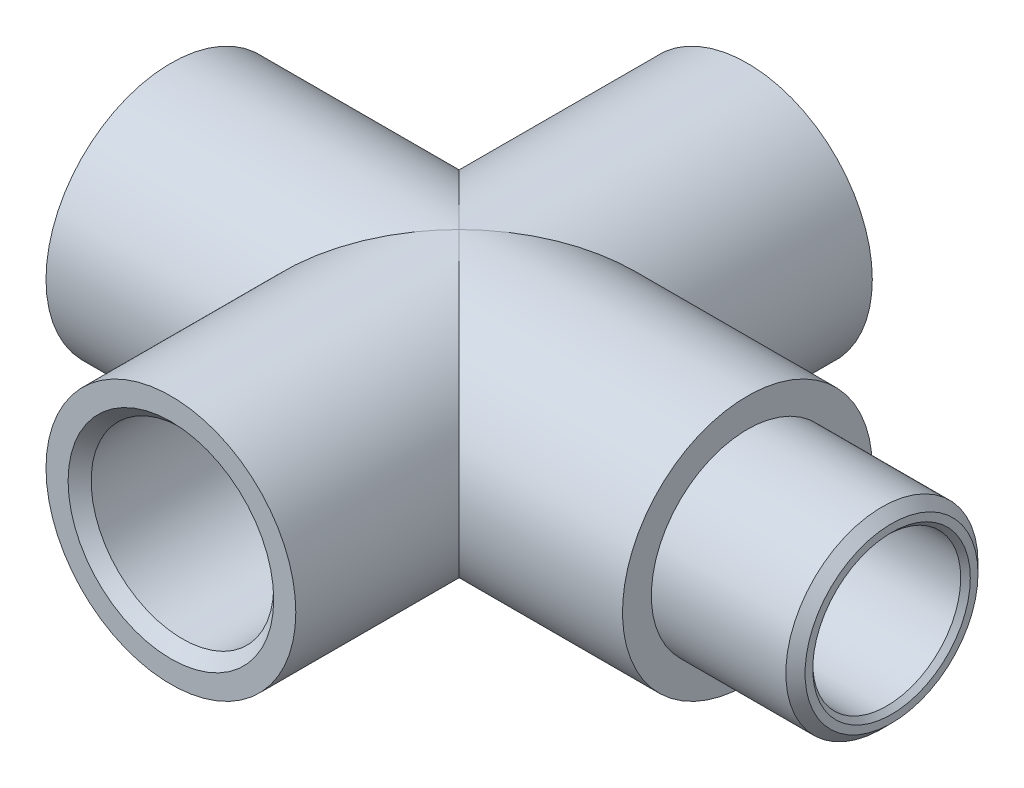
ISO-10303-21;
HEADER;
FILE_DESCRIPTION(('STEP AP214'),'2;1');
FILE_NAME('part.step','',(''),(''),'','','');
FILE_SCHEMA(('AUTOMOTIVE_DESIGN { 1 0 10303 214 1 1 1 1 }'));
ENDSEC;
DATA;
#1=APPLICATION_CONTEXT('core data for automotive mechanical design processes');
#2=APPLICATION_PROTOCOL_DEFINITION('international standard','automotive_design',2000,#1);
#3=PRODUCT_CONTEXT('',#1,'mechanical');
#4=PRODUCT('Part','Part','',(#3));
#5=PRODUCT_RELATED_PRODUCT_CATEGORY('part','',(#4));
#6=PRODUCT_DEFINITION_FORMATION('','',#4);
#7=PRODUCT_DEFINITION_CONTEXT('part definition',#1,'design');
#8=PRODUCT_DEFINITION('design','',#6,#7);
#9=PRODUCT_DEFINITION_SHAPE('','',#8);
#10=(LENGTH_UNIT() NAMED_UNIT(*) SI_UNIT(.MILLI.,.METRE.));
#11=(NAMED_UNIT(*) PLANE_ANGLE_UNIT() SI_UNIT($,.RADIAN.));
#12=(NAMED_UNIT(*) SI_UNIT($,.STERADIAN.) SOLID_ANGLE_UNIT());
#13=UNCERTAINTY_MEASURE_WITH_UNIT(LENGTH_MEASURE(1.E-05),#10,'distance_accuracy_value','');
#14=(GEOMETRIC_REPRESENTATION_CONTEXT(3) GLOBAL_UNCERTAINTY_ASSIGNED_CONTEXT((#13)) GLOBAL_UNIT_ASSIGNED_CONTEXT((#10,
#11,#12)) REPRESENTATION_CONTEXT('',''));
#15=CARTESIAN_POINT('',(0.,0.,0.));
#16=DIRECTION('',(0.,0.,1.));
#17=DIRECTION('',(1.,0.,0.));
#18=AXIS2_PLACEMENT_3D('',#15,#16,#17);
#19=CARTESIAN_POINT('',(45.,0.,0.));
#20=DIRECTION('',(-1.,0.,0.));
#21=DIRECTION('',(0.,0.,1.));
#22=AXIS2_PLACEMENT_3D('',#19,#20,#21);
#23=CYLINDRICAL_SURFACE('',#22,13.);
#24=CARTESIAN_POINT('',(0.,0.,0.));
#25=DIRECTION('',(0.707106781186547,0.,-0.707106781186548));
#26=DIRECTION('',(-0.707106781186547,0.,-0.707106781186548));
#27=AXIS2_PLACEMENT_3D('',#24,#25,#26);
#28=ELLIPSE('',#27,18.3847763108502,13.);
#29=CARTESIAN_POINT('',(0.,13.,0.));
#30=VERTEX_POINT('',#29);
#31=CARTESIAN_POINT('',(0.,-13.,0.));
#32=VERTEX_POINT('',#31);
#33=EDGE_CURVE('E50',#30,#32,#28,.F.);
#34=ORIENTED_EDGE('',*,*,#33,.T.);
#35=CARTESIAN_POINT('',(0.,0.,0.));
#36=DIRECTION('',(-0.707106781186547,0.,-0.707106781186548));
#37=DIRECTION('',(0.707106781186547,0.,-0.707106781186548));
#38=AXIS2_PLACEMENT_3D('',#35,#36,#37);
#39=ELLIPSE('',#38,18.3847763108502,13.);
#40=EDGE_CURVE('E147',#32,#30,#39,.T.);
#41=ORIENTED_EDGE('',*,*,#40,.T.);
#42=EDGE_LOOP('',(#34,#41));
#43=FACE_BOUND('',#42,.T.);
#44=CARTESIAN_POINT('',(-30.,0.,0.));
#45=DIRECTION('',(-1.,0.,0.));
#46=DIRECTION('',(0.,0.,1.));
#47=AXIS2_PLACEMENT_3D('',#44,#45,#46);
#48=CIRCLE('',#47,13.);
#49=CARTESIAN_POINT('',(-30.,0.,13.));
#50=VERTEX_POINT('',#49);
#51=EDGE_CURVE('E59',#50,#50,#48,.T.);
#52=ORIENTED_EDGE('',*,*,#51,.F.);
#53=EDGE_LOOP('',(#52));
#54=FACE_BOUND('',#53,.T.);
#55=ADVANCED_FACE('F29',(#43,#54),#23,.T.);
#56=CARTESIAN_POINT('',(45.001,0.,0.));
#57=DIRECTION('',(-1.,0.,0.));
#58=DIRECTION('',(0.,0.,1.));
#59=AXIS2_PLACEMENT_3D('',#56,#57,#58);
#60=CYLINDRICAL_SURFACE('',#59,9.5);
#61=CARTESIAN_POINT('',(-28.8,0.,0.));
#62=DIRECTION('',(-1.,0.,0.));
#63=DIRECTION('',(0.,0.,1.));
#64=AXIS2_PLACEMENT_3D('',#61,#62,#63);
#65=CIRCLE('',#64,9.5);
#66=CARTESIAN_POINT('',(-28.8,0.,9.5));
#67=VERTEX_POINT('',#66);
#68=EDGE_CURVE('E166',#67,#67,#65,.T.);
#69=ORIENTED_EDGE('',*,*,#68,.T.);
#70=EDGE_LOOP('',(#69));
#71=FACE_BOUND('',#70,.T.);
#72=CARTESIAN_POINT('',(0.,0.,0.));
#73=DIRECTION('',(-0.707106781186547,0.,0.707106781186547));
#74=DIRECTION('',(-0.707106781186547,0.,-0.707106781186547));
#75=AXIS2_PLACEMENT_3D('',#72,#73,#74);
#76=ELLIPSE('',#75,13.4350288425444,9.5);
#77=CARTESIAN_POINT('',(0.,-9.5,0.));
#78=VERTEX_POINT('',#77);
#79=CARTESIAN_POINT('',(0.,9.5,0.));
#80=VERTEX_POINT('',#79);
#81=EDGE_CURVE('E43',#78,#80,#76,.F.);
#82=ORIENTED_EDGE('',*,*,#81,.T.);
#83=CARTESIAN_POINT('',(0.,0.,0.));
#84=DIRECTION('',(-0.707106781186547,0.,-0.707106781186547));
#85=DIRECTION('',(-0.707106781186547,0.,0.707106781186547));
#86=AXIS2_PLACEMENT_3D('',#83,#84,#85);
#87=ELLIPSE('',#86,13.4350288425444,9.5);
#88=EDGE_CURVE('E56',#80,#78,#87,.F.);
#89=ORIENTED_EDGE('',*,*,#88,.T.);
#90=EDGE_LOOP('',(#82,#89));
#91=FACE_BOUND('',#90,.T.);
#92=ADVANCED_FACE('F57',(#71,#91),#60,.F.);
#93=CARTESIAN_POINT('',(0.,0.,0.));
#94=DIRECTION('',(0.707106781186547,0.,-0.707106781186548));
#95=DIRECTION('',(-0.707106781186547,0.,-0.707106781186548));
#96=AXIS2_PLACEMENT_3D('',#93,#94,#95);
#97=ELLIPSE('',#96,18.3847763108502,13.);
#98=EDGE_CURVE('E132',#30,#32,#97,.T.);
#99=ORIENTED_EDGE('',*,*,#98,.T.);
#100=CARTESIAN_POINT('',(0.,0.,0.));
#101=DIRECTION('',(-0.707106781186547,0.,-0.707106781186548));
#102=DIRECTION('',(0.707106781186547,0.,-0.707106781186548));
#103=AXIS2_PLACEMENT_3D('',#100,#101,#102);
#104=ELLIPSE('',#103,18.3847763108502,13.);
#105=EDGE_CURVE('E149',#32,#30,#104,.F.);
#106=ORIENTED_EDGE('',*,*,#105,.T.);
#107=EDGE_LOOP('',(#99,#106));
#108=FACE_BOUND('',#107,.T.);
#109=CARTESIAN_POINT('',(30.,0.,0.));
#110=DIRECTION('',(1.,0.,0.));
#111=DIRECTION('',(0.,0.,-1.));
#112=AXIS2_PLACEMENT_3D('',#109,#110,#111);
#113=CIRCLE('',#112,13.);
#114=CARTESIAN_POINT('',(30.,0.,-13.));
#115=VERTEX_POINT('',#114);
#116=EDGE_CURVE('E135',#115,#115,#113,.T.);
#117=ORIENTED_EDGE('',*,*,#116,.F.);
#118=EDGE_LOOP('',(#117));
#119=FACE_BOUND('',#118,.T.);
#120=ADVANCED_FACE('F82',(#108,#119),#23,.T.);
#121=CARTESIAN_POINT('',(0.,0.,30.));
#122=DIRECTION('',(0.,0.,-1.));
#123=DIRECTION('',(-1.,0.,0.));
#124=AXIS2_PLACEMENT_3D('',#121,#122,#123);
#125=CYLINDRICAL_SURFACE('',#124,13.);
#126=CARTESIAN_POINT('',(0.,0.,30.));
#127=DIRECTION('',(0.,0.,1.));
#128=DIRECTION('',(1.,0.,0.));
#129=AXIS2_PLACEMENT_3D('',#126,#127,#128);
#130=CIRCLE('',#129,13.);
#131=CARTESIAN_POINT('',(13.,0.,30.));
#132=VERTEX_POINT('',#131);
#133=EDGE_CURVE('E139',#132,#132,#130,.T.);
#134=ORIENTED_EDGE('',*,*,#133,.F.);
#135=EDGE_LOOP('',(#134));
#136=FACE_BOUND('',#135,.T.);
#137=ORIENTED_EDGE('',*,*,#40,.F.);
#138=ORIENTED_EDGE('',*,*,#98,.F.);
#139=EDGE_LOOP('',(#137,#138));
#140=FACE_BOUND('',#139,.T.);
#141=ADVANCED_FACE('F121',(#136,#140),#125,.T.);
#142=CARTESIAN_POINT('',(0.,0.,30.));
#143=DIRECTION('',(0.,0.,1.));
#144=DIRECTION('',(1.,0.,0.));
#145=AXIS2_PLACEMENT_3D('',#142,#143,#144);
#146=PLANE('',#145);
#147=CARTESIAN_POINT('',(0.,0.,30.));
#148=DIRECTION('',(0.,0.,1.));
#149=DIRECTION('',(1.,0.,0.));
#150=AXIS2_PLACEMENT_3D('',#147,#148,#149);
#151=CIRCLE('',#150,10.7000000000001);
#152=CARTESIAN_POINT('',(10.7000000000001,0.,30.));
#153=VERTEX_POINT('',#152);
#154=EDGE_CURVE('E160',#153,#153,#151,.F.);
#155=ORIENTED_EDGE('',*,*,#154,.T.);
#156=EDGE_LOOP('',(#155));
#157=FACE_BOUND('',#156,.T.);
#158=ORIENTED_EDGE('',*,*,#133,.T.);
#159=EDGE_LOOP('',(#158));
#160=FACE_BOUND('',#159,.T.);
#161=ADVANCED_FACE('F127',(#157,#160),#146,.T.);
#162=CARTESIAN_POINT('',(0.,0.,-30.));
#163=DIRECTION('',(0.,0.,1.));
#164=DIRECTION('',(1.,0.,0.));
#165=AXIS2_PLACEMENT_3D('',#162,#163,#164);
#166=PLANE('',#165);
#167=CARTESIAN_POINT('',(0.,0.,-30.));
#168=DIRECTION('',(0.,0.,1.));
#169=DIRECTION('',(1.,0.,0.));
#170=AXIS2_PLACEMENT_3D('',#167,#168,#169);
#171=CIRCLE('',#170,10.6999999999999);
#172=CARTESIAN_POINT('',(10.6999999999999,0.,-30.));
#173=VERTEX_POINT('',#172);
#174=EDGE_CURVE('E151',#173,#173,#171,.T.);
#175=ORIENTED_EDGE('',*,*,#174,.T.);
#176=EDGE_LOOP('',(#175));
#177=FACE_BOUND('',#176,.T.);
#178=CARTESIAN_POINT('',(0.,0.,-30.));
#179=DIRECTION('',(0.,0.,1.));
#180=DIRECTION('',(1.,0.,0.));
#181=AXIS2_PLACEMENT_3D('',#178,#179,#180);
#182=CIRCLE('',#181,13.);
#183=CARTESIAN_POINT('',(13.,0.,-30.));
#184=VERTEX_POINT('',#183);
#185=EDGE_CURVE('E137',#184,#184,#182,.T.);
#186=ORIENTED_EDGE('',*,*,#185,.F.);
#187=EDGE_LOOP('',(#186));
#188=FACE_BOUND('',#187,.T.);
#189=ADVANCED_FACE('F197',(#177,#188),#166,.F.);
#190=ORIENTED_EDGE('',*,*,#185,.T.);
#191=EDGE_LOOP('',(#190));
#192=FACE_BOUND('',#191,.T.);
#193=ORIENTED_EDGE('',*,*,#105,.F.);
#194=ORIENTED_EDGE('',*,*,#33,.F.);
#195=EDGE_LOOP('',(#193,#194));
#196=FACE_BOUND('',#195,.T.);
#197=ADVANCED_FACE('F31',(#192,#196),#125,.T.);
#198=CARTESIAN_POINT('',(30.,0.,0.));
#199=DIRECTION('',(1.,0.,0.));
#200=DIRECTION('',(0.,0.,-1.));
#201=AXIS2_PLACEMENT_3D('',#198,#199,#200);
#202=PLANE('',#201);
#203=CARTESIAN_POINT('',(30.,0.,0.));
#204=DIRECTION('',(1.,0.,0.));
#205=DIRECTION('',(0.,0.,-1.));
#206=AXIS2_PLACEMENT_3D('',#203,#204,#205);
#207=CIRCLE('',#206,10.);
#208=CARTESIAN_POINT('',(30.,0.,-10.));
#209=VERTEX_POINT('',#208);
#210=EDGE_CURVE('E66',#209,#209,#207,.T.);
#211=ORIENTED_EDGE('',*,*,#210,.F.);
#212=EDGE_LOOP('',(#211));
#213=FACE_BOUND('',#212,.T.);
#214=ORIENTED_EDGE('',*,*,#116,.T.);
#215=EDGE_LOOP('',(#214));
#216=FACE_BOUND('',#215,.T.);
#217=ADVANCED_FACE('F192',(#213,#216),#202,.T.);
#218=CARTESIAN_POINT('',(30.,0.,0.));
#219=DIRECTION('',(1.,0.,0.));
#220=DIRECTION('',(0.,0.,-1.));
#221=AXIS2_PLACEMENT_3D('',#218,#219,#220);
#222=CYLINDRICAL_SURFACE('',#221,10.);
#223=CARTESIAN_POINT('',(44.,0.,0.));
#224=DIRECTION('',(1.,0.,0.));
#225=DIRECTION('',(0.,0.,-1.));
#226=AXIS2_PLACEMENT_3D('',#223,#224,#225);
#227=CIRCLE('',#226,10.);
#228=CARTESIAN_POINT('',(44.,0.,-10.));
#229=VERTEX_POINT('',#228);
#230=EDGE_CURVE('E172',#229,#229,#227,.F.);
#231=ORIENTED_EDGE('',*,*,#230,.T.);
#232=EDGE_LOOP('',(#231));
#233=FACE_BOUND('',#232,.T.);
#234=ORIENTED_EDGE('',*,*,#210,.T.);
#235=EDGE_LOOP('',(#234));
#236=FACE_BOUND('',#235,.T.);
#237=ADVANCED_FACE('F186',(#233,#236),#222,.T.);
#238=CARTESIAN_POINT('',(45.,0.,0.));
#239=DIRECTION('',(1.,0.,0.));
#240=DIRECTION('',(0.,0.,-1.));
#241=AXIS2_PLACEMENT_3D('',#238,#239,#240);
#242=PLANE('',#241);
#243=CARTESIAN_POINT('',(45.,0.,0.));
#244=DIRECTION('',(1.,0.,0.));
#245=DIRECTION('',(0.,0.,-1.));
#246=AXIS2_PLACEMENT_3D('',#243,#244,#245);
#247=CIRCLE('',#246,8.20000000000005);
#248=CARTESIAN_POINT('',(45.,0.,-8.20000000000005));
#249=VERTEX_POINT('',#248);
#250=EDGE_CURVE('E11',#249,#249,#247,.F.);
#251=ORIENTED_EDGE('',*,*,#250,.T.);
#252=EDGE_LOOP('',(#251));
#253=FACE_BOUND('',#252,.T.);
#254=CARTESIAN_POINT('',(45.,0.,0.));
#255=DIRECTION('',(1.,0.,0.));
#256=DIRECTION('',(0.,0.,-1.));
#257=AXIS2_PLACEMENT_3D('',#254,#255,#256);
#258=CIRCLE('',#257,9.00000000000001);
#259=CARTESIAN_POINT('',(45.,0.,-9.00000000000001));
#260=VERTEX_POINT('',#259);
#261=EDGE_CURVE('E169',#260,#260,#258,.T.);
#262=ORIENTED_EDGE('',*,*,#261,.T.);
#263=EDGE_LOOP('',(#262));
#264=FACE_BOUND('',#263,.T.);
#265=ADVANCED_FACE('F180',(#253,#264),#242,.T.);
#266=CARTESIAN_POINT('',(0.,0.,-60.));
#267=DIRECTION('',(0.,0.,1.));
#268=DIRECTION('',(1.,0.,0.));
#269=AXIS2_PLACEMENT_3D('',#266,#267,#268);
#270=CYLINDRICAL_SURFACE('',#269,9.5);
#271=CARTESIAN_POINT('',(0.,0.,-28.8000000000001));
#272=DIRECTION('',(0.,0.,1.));
#273=DIRECTION('',(1.,0.,0.));
#274=AXIS2_PLACEMENT_3D('',#271,#272,#273);
#275=CIRCLE('',#274,9.5);
#276=CARTESIAN_POINT('',(9.5,0.,-28.8000000000001));
#277=VERTEX_POINT('',#276);
#278=EDGE_CURVE('E157',#277,#277,#275,.F.);
#279=ORIENTED_EDGE('',*,*,#278,.T.);
#280=EDGE_LOOP('',(#279));
#281=FACE_BOUND('',#280,.T.);
#282=CARTESIAN_POINT('',(0.,0.,28.7999999999999));
#283=DIRECTION('',(0.,0.,1.));
#284=DIRECTION('',(1.,0.,0.));
#285=AXIS2_PLACEMENT_3D('',#282,#283,#284);
#286=CIRCLE('',#285,9.5);
#287=CARTESIAN_POINT('',(9.5,0.,28.7999999999999));
#288=VERTEX_POINT('',#287);
#289=EDGE_CURVE('E154',#288,#288,#286,.T.);
#290=ORIENTED_EDGE('',*,*,#289,.T.);
#291=EDGE_LOOP('',(#290));
#292=FACE_BOUND('',#291,.T.);
#293=ORIENTED_EDGE('',*,*,#88,.F.);
#294=ORIENTED_EDGE('',*,*,#81,.F.);
#295=EDGE_LOOP('',(#293,#294));
#296=FACE_BOUND('',#295,.T.);
#297=CARTESIAN_POINT('',(9.50000000000001,0.,-7.7));
#298=CARTESIAN_POINT('',(9.50000060199562,-0.184294837328589,-7.70000061363437));
#299=CARTESIAN_POINT('',(9.494626786743,-0.368581821131114,-7.69337360535048));
#300=CARTESIAN_POINT('',(9.47325779956869,-0.735661957974504,-7.66698595033189));
#301=CARTESIAN_POINT('',(9.45725856634274,-0.918454512751833,-7.6472202816653));
#302=CARTESIAN_POINT('',(9.41498391258546,-1.2811963398829,-7.5948772177766));
#303=CARTESIAN_POINT('',(9.38869666747434,-1.46114209175324,-7.56228508014538));
#304=CARTESIAN_POINT('',(9.32641942953679,-1.81672756486546,-7.48482662025045));
#305=CARTESIAN_POINT('',(9.29042523014909,-1.99236538315643,-7.43995497647153));
#306=CARTESIAN_POINT('',(9.20976066191922,-2.33696751166175,-7.33897861461643));
#307=CARTESIAN_POINT('',(9.16515044790267,-2.50596884239948,-7.28295170054767));
#308=CARTESIAN_POINT('',(9.0679190089043,-2.83773569600927,-7.16020660422362));
#309=CARTESIAN_POINT('',(9.01529429137498,-3.00049846135519,-7.09348376024329));
#310=CARTESIAN_POINT('',(8.90296441466743,-3.31899558127656,-6.9501623136121));
#311=CARTESIAN_POINT('',(8.84326156455398,-3.47473220519266,-6.87356693092451));
#312=CARTESIAN_POINT('',(8.71767687908596,-3.77878011533007,-6.71122452940511));
#313=CARTESIAN_POINT('',(8.65179376471883,-3.92708985476543,-6.62547561573109));
#314=CARTESIAN_POINT('',(8.4904732572727,-4.26716933365774,-6.41361000791218));
#315=CARTESIAN_POINT('',(8.39283860478066,-4.45570685611452,-6.28395924320942));
#316=CARTESIAN_POINT('',(8.19018692523885,-4.81808763632922,-6.01062231671128));
#317=CARTESIAN_POINT('',(8.08516749732521,-4.99192607443509,-5.86693158441342));
#318=CARTESIAN_POINT('',(7.86973559082798,-5.32510197048703,-5.56630648323618));
#319=CARTESIAN_POINT('',(7.75930974439182,-5.48440037315586,-5.40933850823564));
#320=CARTESIAN_POINT('',(7.53565416441958,-5.78786998519767,-5.08332182967543));
#321=CARTESIAN_POINT('',(7.42242476292585,-5.93204297547431,-4.91427455231192));
#322=CARTESIAN_POINT('',(7.19375832851689,-6.20744630690823,-4.5616324541405));
#323=CARTESIAN_POINT('',(7.07831573473458,-6.33842340005267,-4.37784339756106));
#324=CARTESIAN_POINT('',(6.85003646974171,-6.58446346351502,-3.99825325492573));
#325=CARTESIAN_POINT('',(6.73720065472872,-6.69952126534029,-3.80244829733066));
#326=CARTESIAN_POINT('',(6.51810110843805,-6.91286189916482,-3.39915048705089));
#327=CARTESIAN_POINT('',(6.41182071851336,-7.01118847159316,-3.19169005693006));
#328=CARTESIAN_POINT('',(6.21021745534324,-7.19036610648815,-2.76447041219176));
#329=CARTESIAN_POINT('',(6.11488518815135,-7.27123220401641,-2.54472198562962));
#330=CARTESIAN_POINT('',(5.92948374761042,-7.4234403985535,-2.06261187873916));
#331=CARTESIAN_POINT('',(5.84175587946682,-7.49213102324588,-1.79844685014092));
#332=CARTESIAN_POINT('',(5.73416091550723,-7.57439394885963,-1.39199842729054));
#333=CARTESIAN_POINT('',(5.70230894673812,-7.59834349731201,-1.25491231921265));
#334=CARTESIAN_POINT('',(5.64781782479695,-7.63893389367137,-0.977883626959548));
#335=CARTESIAN_POINT('',(5.62517397991777,-7.65557846394154,-0.83794253571841));
#336=CARTESIAN_POINT('',(5.58996074178087,-7.68132974362423,-0.554626560856323));
#337=CARTESIAN_POINT('',(5.57749690721442,-7.69035750363813,-0.411231187907534));
#338=CARTESIAN_POINT('',(5.56369112296523,-7.70035168462259,-0.123624571188604));
#339=CARTESIAN_POINT('',(5.56234850042442,-7.70131859329262,0.0205866226942667));
#340=CARTESIAN_POINT('',(5.57086087522769,-7.69516311508476,0.308580525317448));
#341=CARTESIAN_POINT('',(5.58072213337322,-7.68803620532939,0.452362949423261));
#342=CARTESIAN_POINT('',(5.61112216096261,-7.66587604236562,0.738174195384513));
#343=CARTESIAN_POINT('',(5.63166239485853,-7.6508417047757,0.880202773992409));
#344=CARTESIAN_POINT('',(5.68587790921006,-7.61065558097644,1.18064015152002));
#345=CARTESIAN_POINT('',(5.72096079018183,-7.58440498132662,1.33864631573403));
#346=CARTESIAN_POINT('',(5.80175525862541,-7.52277923240657,1.65016367741425));
#347=CARTESIAN_POINT('',(5.84747468906847,-7.48739734797319,1.80367146344906));
#348=CARTESIAN_POINT('',(5.94765445765314,-7.40806935844173,2.10594127585473));
#349=CARTESIAN_POINT('',(6.00213605178837,-7.3641023698851,2.25469067928437));
#350=CARTESIAN_POINT('',(6.11786692869187,-7.26824288854571,2.54681660898496));
#351=CARTESIAN_POINT('',(6.17911461602819,-7.2163522630431,2.69019439124137));
#352=CARTESIAN_POINT('',(6.34014457086626,-7.07595623094524,3.04532728880174));
#353=CARTESIAN_POINT('',(6.44331870284603,-6.98250090635934,3.2535979613594));
#354=CARTESIAN_POINT('',(6.65680162084462,-6.77928849771215,3.65821456767469));
#355=CARTESIAN_POINT('',(6.76711395829882,-6.66952326330973,3.85455446990848));
#356=CARTESIAN_POINT('',(6.99127768621696,-6.43416550785932,4.23576941930396));
#357=CARTESIAN_POINT('',(7.1051332842018,-6.30855358351901,4.42062998946262));
#358=CARTESIAN_POINT('',(7.33320148392262,-6.04193179674476,4.77858252447695));
#359=CARTESIAN_POINT('',(7.44741401960812,-5.90092463622134,4.95167654577269));
#360=CARTESIAN_POINT('',(7.67740149448922,-5.59864035288438,5.29137283305578));
#361=CARTESIAN_POINT('',(7.79310097995119,-5.43684310964351,5.45756450214391));
#362=CARTESIAN_POINT('',(8.01951028313257,-5.09697505128744,5.77625385805733));
#363=CARTESIAN_POINT('',(8.13021934958703,-4.91890179809371,5.92874948646726));
#364=CARTESIAN_POINT('',(8.3438410446587,-4.54710762171198,6.21845866803888));
#365=CARTESIAN_POINT('',(8.44677027157175,-4.35342194473164,6.35570506763527));
#366=CARTESIAN_POINT('',(8.64252091138817,-3.95056064818939,6.61363852178494));
#367=CARTESIAN_POINT('',(8.73534662928147,-3.7413916902101,6.7343326348232));
#368=CARTESIAN_POINT('',(8.88415494358704,-3.36898002035042,6.92609302854562));
#369=CARTESIAN_POINT('',(8.94318635826871,-3.20922834507842,7.00160487549002));
#370=CARTESIAN_POINT('',(9.05370940967248,-2.88271245627872,7.1422367978665));
#371=CARTESIAN_POINT('',(9.10520290824283,-2.71594998754447,7.20735943976689));
#372=CARTESIAN_POINT('',(9.19971056771638,-2.37621484182019,7.32638946974355));
#373=CARTESIAN_POINT('',(9.24272871579446,-2.20324513048104,7.38030213214783));
#374=CARTESIAN_POINT('',(9.31946624407271,-1.85198831184051,7.47618068607392));
#375=CARTESIAN_POINT('',(9.35318540751884,-1.67370108069809,7.51814629911755));
#376=CARTESIAN_POINT('',(9.4107676999669,-1.31194204960503,7.58966413929109));
#377=CARTESIAN_POINT('',(9.43457086787055,-1.12844567629803,7.61914086504735));
#378=CARTESIAN_POINT('',(9.47147485696979,-0.758730799367607,7.66479072828746));
#379=CARTESIAN_POINT('',(9.48457568804063,-0.572512298256118,7.68096387804679));
#380=CARTESIAN_POINT('',(9.49975465413367,-0.198980715256382,7.69969925906128));
#381=CARTESIAN_POINT('',(9.50183510622421,-0.011667871748919,7.70226435145224));
#382=CARTESIAN_POINT('',(9.49492681775657,0.362433326599813,7.69374044188107));
#383=CARTESIAN_POINT('',(9.48593879653898,0.549221714734755,7.68265232724148));
#384=CARTESIAN_POINT('',(9.45845206905349,0.90348194279088,7.64868638360257));
#385=CARTESIAN_POINT('',(9.44090877357427,1.07114403255274,7.62699245055871));
#386=CARTESIAN_POINT('',(9.39722892961385,1.40364239821743,7.57285728963266));
#387=CARTESIAN_POINT('',(9.37108952173921,1.56847771460576,7.54041248557512));
#388=CARTESIAN_POINT('',(9.31071514512386,1.89420540598275,7.46524730038459));
#389=CARTESIAN_POINT('',(9.27648284502691,2.05509906147966,7.42253030644259));
#390=CARTESIAN_POINT('',(9.20050098179044,2.37221035540694,7.32734872139414));
#391=CARTESIAN_POINT('',(9.15874858744702,2.52842620679131,7.27488045884187));
#392=CARTESIAN_POINT('',(9.06622613490185,2.8428264146149,7.1580577971094));
#393=CARTESIAN_POINT('',(9.01511901419872,3.00074426427957,7.09325318669798));
#394=CARTESIAN_POINT('',(8.90620586876285,3.3100492255716,6.95430480582851));
#395=CARTESIAN_POINT('',(8.8483972122549,3.46143373923313,6.88015736532619));
#396=CARTESIAN_POINT('',(8.66613879359168,3.90514029212346,6.64469072842269));
#397=CARTESIAN_POINT('',(8.53283518527151,4.18708605276842,6.47032051316196));
#398=CARTESIAN_POINT('',(8.28863532291001,4.64721652076225,6.1440793301269));
#399=CARTESIAN_POINT('',(8.18165361047685,4.83261792527714,5.99920129755334));
#400=CARTESIAN_POINT('',(7.96143842465426,5.18739103407368,5.69521704863639));
#401=CARTESIAN_POINT('',(7.84820490657325,5.35676262374131,5.53611073057584));
#402=CARTESIAN_POINT('',(7.61780730707473,5.67965284962913,5.20435173231928));
#403=CARTESIAN_POINT('',(7.50063487506292,5.83313456997565,5.03166907783328));
#404=CARTESIAN_POINT('',(7.26534273581407,6.12370051383776,4.67369514937104));
#405=CARTESIAN_POINT('',(7.14722326208122,6.26078865429786,4.48840690393522));
#406=CARTESIAN_POINT('',(6.93085888314652,6.49884672220416,4.13440765064028));
#407=CARTESIAN_POINT('',(6.83231448759198,6.60214194169395,3.96743896545707));
#408=CARTESIAN_POINT('',(6.63898446021813,6.79651861329242,3.62439186367326));
#409=CARTESIAN_POINT('',(6.54419932580834,6.88759845288575,3.44831224860958));
#410=CARTESIAN_POINT('',(6.36136240780996,7.05680818389331,3.0872461739263));
#411=CARTESIAN_POINT('',(6.2732948588981,7.13496893204753,2.90228234006234));
#412=CARTESIAN_POINT('',(6.10709400424157,7.2777328141055,2.52303132221984));
#413=CARTESIAN_POINT('',(6.02895499375723,7.34234374747221,2.32874958133553));
#414=CARTESIAN_POINT('',(5.86632498841086,7.47329039362943,1.87367756790926));
#415=CARTESIAN_POINT('',(5.78639714290445,7.53484517520923,1.60974378670471));
#416=CARTESIAN_POINT('',(5.69156926962994,7.60641850156115,1.20466507324402));
#417=CARTESIAN_POINT('',(5.66414593311875,7.62681065817269,1.06819083016532));
#418=CARTESIAN_POINT('',(5.61873402975673,7.66032837321451,0.792825092815481));
#419=CARTESIAN_POINT('',(5.60074081879279,7.67345750868763,0.653934823266377));
#420=CARTESIAN_POINT('',(5.57493291356991,7.69222883206169,0.373530331058795));
#421=CARTESIAN_POINT('',(5.56720394050529,7.69780797386593,0.232003897741596));
#422=CARTESIAN_POINT('',(5.56260504918981,7.70113198615733,-0.051316023751375));
#423=CARTESIAN_POINT('',(5.56573473836164,7.69887713986961,-0.193109502087331));
#424=CARTESIAN_POINT('',(5.58269347177577,7.68658835323148,-0.47580871015171));
#425=CARTESIAN_POINT('',(5.59653023162788,7.67654880314393,-0.616713725796757));
#426=CARTESIAN_POINT('',(5.63422020752641,7.64892817490951,-0.896480053102158));
#427=CARTESIAN_POINT('',(5.658078897452,7.63134297529032,-1.03534020491224));
#428=CARTESIAN_POINT('',(5.72031954315889,7.58483580858621,-1.33713744772598));
#429=CARTESIAN_POINT('',(5.76063550400881,7.5543639486384,-1.49943551329211));
#430=CARTESIAN_POINT('',(5.85192971834556,7.48386496825469,-1.81894829448751));
#431=CARTESIAN_POINT('',(5.90291638590248,7.44383030381019,-1.97615888490846));
#432=CARTESIAN_POINT('',(6.01347735336912,7.3548034253363,-2.28534788213801));
#433=CARTESIAN_POINT('',(6.07307242617907,7.30578946437586,-2.43731249818031));
#434=CARTESIAN_POINT('',(6.19874455888461,7.19946847526783,-2.73545195682357));
#435=CARTESIAN_POINT('',(6.2648199159369,7.14216362387099,-2.88162830632737));
#436=CARTESIAN_POINT('',(6.43670058558546,6.98842528479531,-3.24150867743236));
#437=CARTESIAN_POINT('',(6.54557294286116,6.88694749370795,-3.45160471799929));
#438=CARTESIAN_POINT('',(6.76944242262004,6.66703221414109,-3.85932094930584));
#439=CARTESIAN_POINT('',(6.88444241628748,6.54858673054988,-4.05693519506169));
#440=CARTESIAN_POINT('',(7.11694946376056,6.29512867711167,-4.44006277850239));
#441=CARTESIAN_POINT('',(7.23445919942864,6.16009756868408,-4.62556221367826));
#442=CARTESIAN_POINT('',(7.46875182896219,5.87383717676454,-4.98403791053235));
#443=CARTESIAN_POINT('',(7.58553484531295,5.72261070572116,-5.1570163378637));
#444=CARTESIAN_POINT('',(7.81849258265193,5.40015702770602,-5.49399624402912));
#445=CARTESIAN_POINT('',(7.93458334916725,5.22853267080144,-5.65767685000565));
#446=CARTESIAN_POINT('',(8.16047463409989,4.86845244949779,-5.97034497130274));
#447=CARTESIAN_POINT('',(8.27027410187515,4.67999378715224,-6.11933003545902));
#448=CARTESIAN_POINT('',(8.48062551556872,4.28702144843522,-6.40075934552939));
#449=CARTESIAN_POINT('',(8.58119783512655,4.0825450866915,-6.53324027629221));
#450=CARTESIAN_POINT('',(8.77062123003475,3.65789257531555,-6.78012236707602));
#451=CARTESIAN_POINT('',(8.85947861091994,3.43772497058349,-6.89453325986684));
#452=CARTESIAN_POINT('',(8.99763572601267,3.05295799974159,-7.07102940998996));
#453=CARTESIAN_POINT('',(9.0506950673476,2.89210204253091,-7.13838372781406));
#454=CARTESIAN_POINT('',(9.14902240191604,2.56411313375472,-7.2626480393755));
#455=CARTESIAN_POINT('',(9.19429240115762,2.3969818118466,-7.31956072242321));
#456=CARTESIAN_POINT('',(9.27614483371056,2.05756064082482,-7.42211664655673));
#457=CARTESIAN_POINT('',(9.31274302032148,1.88528079603075,-7.46778032876913));
#458=CARTESIAN_POINT('',(9.37661970149916,1.53637392898918,-7.54728806760158));
#459=CARTESIAN_POINT('',(9.40390137211446,1.3597484102617,-7.58113615230757));
#460=CARTESIAN_POINT('',(9.45059839127935,0.98718574100941,-7.63898749916614));
#461=CARTESIAN_POINT('',(9.46907873672074,0.790947156254707,-7.66182300811734));
#462=CARTESIAN_POINT('',(9.49378078518808,0.396469684723349,-7.69233086786498));
#463=CARTESIAN_POINT('',(9.49999935248447,0.198230299302138,-7.69999933996565));
#464=CARTESIAN_POINT('',(9.50000000000001,0.,-7.7));
#465=B_SPLINE_CURVE_WITH_KNOTS('',3,(#297,#298,#299,#300,#301,#302,#303,#304,#305,#306,#307,
#308,#309,#310,#311,#312,#313,#314,#315,#316,#317,#318,#319,#320,#321,#322,#323,#324,#325,#326,
#327,#328,#329,#330,#331,#332,#333,#334,#335,#336,#337,#338,#339,#340,#341,#342,#343,#344,#345,
#346,#347,#348,#349,#350,#351,#352,#353,#354,#355,#356,#357,#358,#359,#360,#361,#362,#363,#364,
#365,#366,#367,#368,#369,#370,#371,#372,#373,#374,#375,#376,#377,#378,#379,#380,#381,#382,#383,
#384,#385,#386,#387,#388,#389,#390,#391,#392,#393,#394,#395,#396,#397,#398,#399,#400,#401,#402,
#403,#404,#405,#406,#407,#408,#409,#410,#411,#412,#413,#414,#415,#416,#417,#418,#419,#420,#421,
#422,#423,#424,#425,#426,#427,#428,#429,#430,#431,#432,#433,#434,#435,#436,#437,#438,#439,#440,
#441,#442,#443,#444,#445,#446,#447,#448,#449,#450,#451,#452,#453,#454,#455,#456,#457,#458,#459,
#460,#461,#462,#463,#464),.UNSPECIFIED.,.T.,.F.,(4,2,2,2,2,2,2,2,2,2,2,2,2,2,2,2,2,2,2,2,2,2,2,
2,2,2,2,2,2,2,2,2,2,2,2,2,2,2,2,2,2,2,2,2,2,2,2,2,2,2,2,2,2,2,2,2,2,2,2,2,2,2,2,2,2,2,2,2,2,2,2,
2,2,2,2,2,2,2,2,2,2,2,2,4),(0.,0.552675636742636,1.1055626418058,1.65908698548329,
2.21285158846806,2.76288126041661,3.31315131291708,3.86324234490785,4.41344747106293,
5.15870624496305,5.90420844021466,6.65165753385961,7.3990185219858,8.15872967604759,
8.91868690849602,9.67662579958683,10.4339094100828,11.2907932628663,11.7186526804063,
12.1462938217913,12.5783148982778,13.0103098363367,13.442546294761,13.874842043197,
14.3659956944656,14.8575126573317,15.350240485573,15.8428523765237,16.5932680601359,
17.3440600083662,18.0957803434667,18.847368960803,19.6240887485164,20.4009250769034,
21.176054282116,21.9508519099182,22.5092345480478,23.0674790333673,23.6254602657023,
24.1834545031629,24.744775548954,25.3060960768024,25.8672985806093,26.4284646137645,
26.9377846357742,27.4472742486227,27.9565960902429,28.4661100863284,29.0001227034365,
29.5343457488389,30.6025583245264,31.3771073331913,32.1516618795037,32.9279773166693,
33.7041068953516,34.3626333848251,35.0212467190052,35.6782635096814,36.3349010679224,
37.1791374802766,37.6007677273354,38.0221901359204,38.4471103486212,38.8720151991819,
39.2972265253991,39.7226704004498,40.2318316124307,40.7413958313862,41.2522108814139,
41.7628920608937,42.5341872316794,43.3058470365695,44.0783773501965,44.8507737249025,
45.6419655810789,46.4332891828827,47.2228212236445,48.011926550653,48.5582592880784,
49.1044511158415,49.6496429857886,50.1946488110315,50.7889630740856,51.3834293026385),.UNSPECIFIED.);
#466=CARTESIAN_POINT('',(9.50000000000001,0.,-7.7));
#467=VERTEX_POINT('',#466);
#468=EDGE_CURVE('E63',#467,#467,#465,.T.);
#469=ORIENTED_EDGE('',*,*,#468,.F.);
#470=EDGE_LOOP('',(#469));
#471=FACE_BOUND('',#470,.T.);
#472=ADVANCED_FACE('F61',(#281,#292,#296,#471),#270,.F.);
#473=CARTESIAN_POINT('',(-45.001,0.,0.));
#474=DIRECTION('',(1.,0.,0.));
#475=DIRECTION('',(0.,0.,-1.));
#476=AXIS2_PLACEMENT_3D('',#473,#474,#475);
#477=CYLINDRICAL_SURFACE('',#476,7.7);
#478=CARTESIAN_POINT('',(44.4999999999999,0.,0.));
#479=DIRECTION('',(1.,0.,0.));
#480=DIRECTION('',(0.,0.,-1.));
#481=AXIS2_PLACEMENT_3D('',#478,#479,#480);
#482=CIRCLE('',#481,7.7);
#483=CARTESIAN_POINT('',(44.4999999999999,0.,-7.7));
#484=VERTEX_POINT('',#483);
#485=EDGE_CURVE('E37',#484,#484,#482,.T.);
#486=ORIENTED_EDGE('',*,*,#485,.T.);
#487=EDGE_LOOP('',(#486));
#488=FACE_BOUND('',#487,.T.);
#489=ORIENTED_EDGE('',*,*,#468,.T.);
#490=EDGE_LOOP('',(#489));
#491=FACE_BOUND('',#490,.T.);
#492=ADVANCED_FACE('F75',(#488,#491),#477,.F.);
#493=CARTESIAN_POINT('',(-30.,0.,0.));
#494=DIRECTION('',(-1.,0.,0.));
#495=DIRECTION('',(0.,0.,1.));
#496=AXIS2_PLACEMENT_3D('',#493,#494,#495);
#497=PLANE('',#496);
#498=CARTESIAN_POINT('',(-30.,0.,0.));
#499=DIRECTION('',(-1.,0.,0.));
#500=DIRECTION('',(0.,0.,1.));
#501=AXIS2_PLACEMENT_3D('',#498,#499,#500);
#502=CIRCLE('',#501,10.7);
#503=CARTESIAN_POINT('',(-30.,0.,10.7));
#504=VERTEX_POINT('',#503);
#505=EDGE_CURVE('E163',#504,#504,#502,.F.);
#506=ORIENTED_EDGE('',*,*,#505,.T.);
#507=EDGE_LOOP('',(#506));
#508=FACE_BOUND('',#507,.T.);
#509=ORIENTED_EDGE('',*,*,#51,.T.);
#510=EDGE_LOOP('',(#509));
#511=FACE_BOUND('',#510,.T.);
#512=ADVANCED_FACE('F84',(#508,#511),#497,.T.);
#513=CARTESIAN_POINT('',(0.,0.,-30.));
#514=DIRECTION('',(0.,0.,-1.));
#515=DIRECTION('',(-1.,0.,0.));
#516=AXIS2_PLACEMENT_3D('',#513,#514,#515);
#517=CONICAL_SURFACE('',#516,10.6999999999999,0.785398163397445);
#518=ORIENTED_EDGE('',*,*,#278,.F.);
#519=EDGE_LOOP('',(#518));
#520=FACE_BOUND('',#519,.T.);
#521=ORIENTED_EDGE('',*,*,#174,.F.);
#522=EDGE_LOOP('',(#521));
#523=FACE_BOUND('',#522,.T.);
#524=ADVANCED_FACE('F87',(#520,#523),#517,.F.);
#525=CARTESIAN_POINT('',(0.,0.,28.7999999999999));
#526=DIRECTION('',(0.,0.,1.));
#527=DIRECTION('',(1.,0.,0.));
#528=AXIS2_PLACEMENT_3D('',#525,#526,#527);
#529=CONICAL_SURFACE('',#528,9.5,0.785398163397446);
#530=ORIENTED_EDGE('',*,*,#154,.F.);
#531=EDGE_LOOP('',(#530));
#532=FACE_BOUND('',#531,.T.);
#533=ORIENTED_EDGE('',*,*,#289,.F.);
#534=EDGE_LOOP('',(#533));
#535=FACE_BOUND('',#534,.T.);
#536=ADVANCED_FACE('F91',(#532,#535),#529,.F.);
#537=CARTESIAN_POINT('',(-30.,0.,0.));
#538=DIRECTION('',(-1.,0.,0.));
#539=DIRECTION('',(0.,0.,1.));
#540=AXIS2_PLACEMENT_3D('',#537,#538,#539);
#541=CONICAL_SURFACE('',#540,10.7,0.785398163397448);
#542=ORIENTED_EDGE('',*,*,#68,.F.);
#543=EDGE_LOOP('',(#542));
#544=FACE_BOUND('',#543,.T.);
#545=ORIENTED_EDGE('',*,*,#505,.F.);
#546=EDGE_LOOP('',(#545));
#547=FACE_BOUND('',#546,.T.);
#548=ADVANCED_FACE('F95',(#544,#547),#541,.F.);
#549=CARTESIAN_POINT('',(45.,0.,0.));
#550=DIRECTION('',(-1.,0.,0.));
#551=DIRECTION('',(0.,0.,1.));
#552=AXIS2_PLACEMENT_3D('',#549,#550,#551);
#553=CONICAL_SURFACE('',#552,9.00000000000001,0.785398163397444);
#554=ORIENTED_EDGE('',*,*,#230,.F.);
#555=EDGE_LOOP('',(#554));
#556=FACE_BOUND('',#555,.T.);
#557=ORIENTED_EDGE('',*,*,#261,.F.);
#558=EDGE_LOOP('',(#557));
#559=FACE_BOUND('',#558,.T.);
#560=ADVANCED_FACE('F99',(#556,#559),#553,.T.);
#561=CARTESIAN_POINT('',(44.4999999999999,0.,0.));
#562=DIRECTION('',(1.,0.,0.));
#563=DIRECTION('',(0.,0.,-1.));
#564=AXIS2_PLACEMENT_3D('',#561,#562,#563);
#565=CONICAL_SURFACE('',#564,7.7,0.785398163397447);
#566=ORIENTED_EDGE('',*,*,#250,.F.);
#567=EDGE_LOOP('',(#566));
#568=FACE_BOUND('',#567,.T.);
#569=ORIENTED_EDGE('',*,*,#485,.F.);
#570=EDGE_LOOP('',(#569));
#571=FACE_BOUND('',#570,.T.);
#572=ADVANCED_FACE('F103',(#568,#571),#565,.F.);
#573=CLOSED_SHELL('',(#55,#92,#120,#141,#161,#189,#197,#217,#237,#265,#472,#492,#512,#524,#536,
#548,#560,#572));
#574=MANIFOLD_SOLID_BREP('B2',#573);
#575=ADVANCED_BREP_SHAPE_REPRESENTATION('',(#18,#574),#14);
#576=SHAPE_DEFINITION_REPRESENTATION(#9,#575);
ENDSEC;
END-ISO-10303-21;
